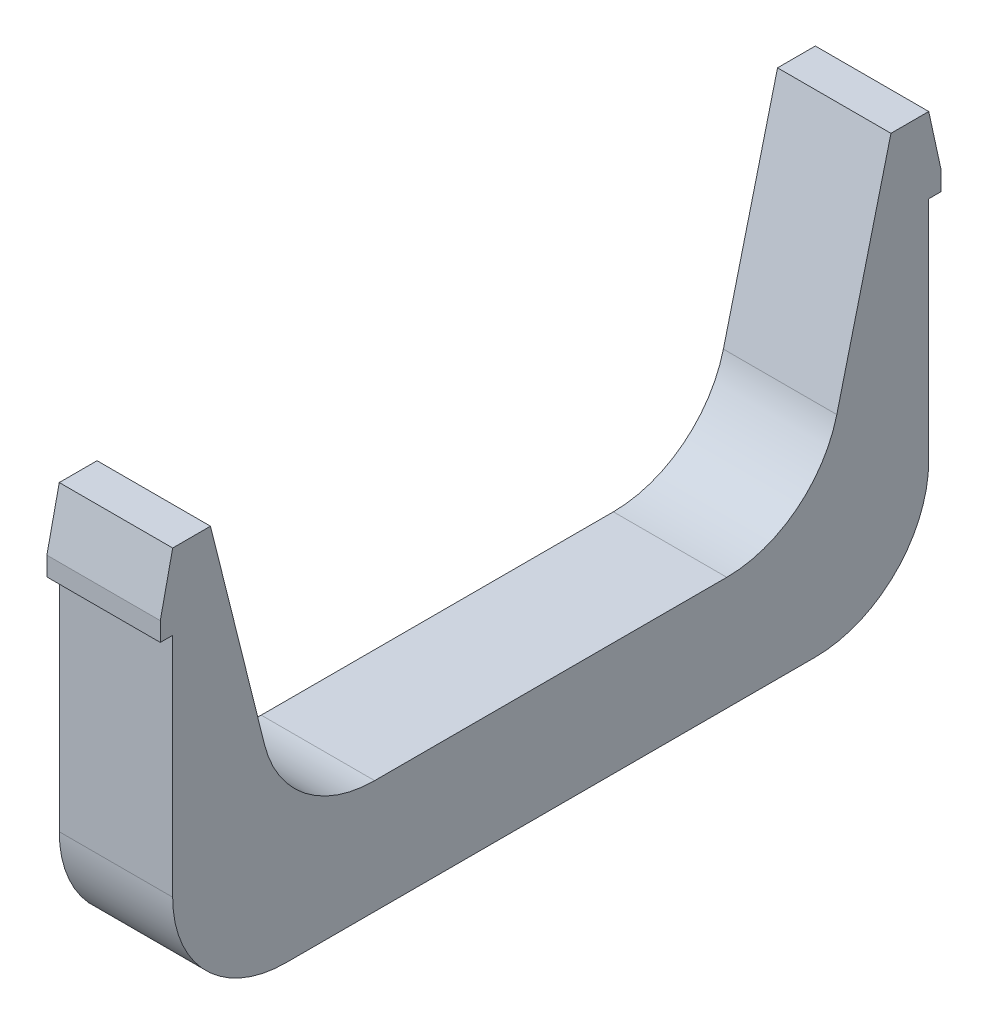
ISO-10303-21;
HEADER;
FILE_DESCRIPTION(('STEP AP214'),'2;1');
FILE_NAME('part.step','',(''),(''),'','','');
FILE_SCHEMA(('AUTOMOTIVE_DESIGN { 1 0 10303 214 1 1 1 1 }'));
ENDSEC;
DATA;
#1=APPLICATION_CONTEXT('core data for automotive mechanical design processes');
#2=APPLICATION_PROTOCOL_DEFINITION('international standard','automotive_design',2000,#1);
#3=PRODUCT_CONTEXT('',#1,'mechanical');
#4=PRODUCT('Part','Part','',(#3));
#5=PRODUCT_RELATED_PRODUCT_CATEGORY('part','',(#4));
#6=PRODUCT_DEFINITION_FORMATION('','',#4);
#7=PRODUCT_DEFINITION_CONTEXT('part definition',#1,'design');
#8=PRODUCT_DEFINITION('design','',#6,#7);
#9=PRODUCT_DEFINITION_SHAPE('','',#8);
#10=(LENGTH_UNIT() NAMED_UNIT(*) SI_UNIT(.MILLI.,.METRE.));
#11=(NAMED_UNIT(*) PLANE_ANGLE_UNIT() SI_UNIT($,.RADIAN.));
#12=(NAMED_UNIT(*) SI_UNIT($,.STERADIAN.) SOLID_ANGLE_UNIT());
#13=UNCERTAINTY_MEASURE_WITH_UNIT(LENGTH_MEASURE(1.E-05),#10,'distance_accuracy_value','');
#14=(GEOMETRIC_REPRESENTATION_CONTEXT(3) GLOBAL_UNCERTAINTY_ASSIGNED_CONTEXT((#13)) GLOBAL_UNIT_ASSIGNED_CONTEXT((#10,
#11,#12)) REPRESENTATION_CONTEXT('',''));
#15=CARTESIAN_POINT('',(0.,0.,0.));
#16=DIRECTION('',(0.,0.,1.));
#17=DIRECTION('',(1.,0.,0.));
#18=AXIS2_PLACEMENT_3D('',#15,#16,#17);
#19=CARTESIAN_POINT('',(-3.,1.5,10.));
#20=DIRECTION('',(0.,-1.,0.));
#21=DIRECTION('',(0.,0.,-1.));
#22=AXIS2_PLACEMENT_3D('',#19,#20,#21);
#23=PLANE('',#22);
#24=DIRECTION('',(0.,0.,-1.));
#25=VECTOR('',#24,1.);
#26=CARTESIAN_POINT('',(-3.,1.5,10.));
#27=LINE('',#26,#25);
#28=CARTESIAN_POINT('',(-3.,1.5,4.65767078078676));
#29=VERTEX_POINT('',#28);
#30=CARTESIAN_POINT('',(-3.,1.5,-4.65767078078676));
#31=VERTEX_POINT('',#30);
#32=EDGE_CURVE('E245',#29,#31,#27,.T.);
#33=ORIENTED_EDGE('',*,*,#32,.F.);
#34=DIRECTION('',(-1.,0.,0.));
#35=VECTOR('',#34,1.);
#36=CARTESIAN_POINT('',(-3.,1.5,4.65767078078676));
#37=LINE('',#36,#35);
#38=CARTESIAN_POINT('',(0.,1.5,4.65767078078676));
#39=VERTEX_POINT('',#38);
#40=EDGE_CURVE('E265',#29,#39,#37,.F.);
#41=ORIENTED_EDGE('',*,*,#40,.T.);
#42=DIRECTION('',(0.,0.,-1.));
#43=VECTOR('',#42,1.);
#44=CARTESIAN_POINT('',(0.,1.5,10.));
#45=LINE('',#44,#43);
#46=CARTESIAN_POINT('',(0.,1.5,-4.65767078078676));
#47=VERTEX_POINT('',#46);
#48=EDGE_CURVE('E279',#39,#47,#45,.T.);
#49=ORIENTED_EDGE('',*,*,#48,.T.);
#50=DIRECTION('',(1.,0.,0.));
#51=VECTOR('',#50,1.);
#52=CARTESIAN_POINT('',(-3.,1.5,-4.65767078078676));
#53=LINE('',#52,#51);
#54=EDGE_CURVE('E263',#47,#31,#53,.F.);
#55=ORIENTED_EDGE('',*,*,#54,.T.);
#56=EDGE_LOOP('',(#33,#41,#49,#55));
#57=FACE_BOUND('',#56,.T.);
#58=ADVANCED_FACE('F36',(#57),#23,.F.);
#59=CARTESIAN_POINT('',(-3.,-1.5,10.));
#60=DIRECTION('',(0.,-1.,0.));
#61=DIRECTION('',(0.,0.,-1.));
#62=AXIS2_PLACEMENT_3D('',#59,#60,#61);
#63=PLANE('',#62);
#64=DIRECTION('',(0.,0.,-1.));
#65=VECTOR('',#64,1.);
#66=CARTESIAN_POINT('',(0.,-1.5,10.));
#67=LINE('',#66,#65);
#68=CARTESIAN_POINT('',(0.,-1.5,7.));
#69=VERTEX_POINT('',#68);
#70=CARTESIAN_POINT('',(0.,-1.5,-7.));
#71=VERTEX_POINT('',#70);
#72=EDGE_CURVE('E238',#69,#71,#67,.T.);
#73=ORIENTED_EDGE('',*,*,#72,.F.);
#74=DIRECTION('',(1.,0.,0.));
#75=VECTOR('',#74,1.);
#76=CARTESIAN_POINT('',(-3.,-1.5,7.));
#77=LINE('',#76,#75);
#78=CARTESIAN_POINT('',(-3.,-1.5,7.));
#79=VERTEX_POINT('',#78);
#80=EDGE_CURVE('E253',#69,#79,#77,.F.);
#81=ORIENTED_EDGE('',*,*,#80,.T.);
#82=DIRECTION('',(0.,0.,-1.));
#83=VECTOR('',#82,1.);
#84=CARTESIAN_POINT('',(-3.,-1.5,10.));
#85=LINE('',#84,#83);
#86=CARTESIAN_POINT('',(-3.,-1.5,-7.));
#87=VERTEX_POINT('',#86);
#88=EDGE_CURVE('E239',#79,#87,#85,.T.);
#89=ORIENTED_EDGE('',*,*,#88,.T.);
#90=DIRECTION('',(1.,0.,0.));
#91=VECTOR('',#90,1.);
#92=CARTESIAN_POINT('',(0.,-1.5,-7.));
#93=LINE('',#92,#91);
#94=EDGE_CURVE('E313',#87,#71,#93,.T.);
#95=ORIENTED_EDGE('',*,*,#94,.T.);
#96=EDGE_LOOP('',(#73,#81,#89,#95));
#97=FACE_BOUND('',#96,.T.);
#98=ADVANCED_FACE('F376',(#97),#63,.T.);
#99=CARTESIAN_POINT('',(-3.,-1.5,10.));
#100=DIRECTION('',(0.,0.,-1.));
#101=DIRECTION('',(-1.,0.,0.));
#102=AXIS2_PLACEMENT_3D('',#99,#100,#101);
#103=PLANE('',#102);
#104=DIRECTION('',(0.,1.,0.));
#105=VECTOR('',#104,1.);
#106=CARTESIAN_POINT('',(-3.,-1.5,10.));
#107=LINE('',#106,#105);
#108=CARTESIAN_POINT('',(-3.,1.5,10.));
#109=VERTEX_POINT('',#108);
#110=CARTESIAN_POINT('',(-3.,7.50000000000001,10.));
#111=VERTEX_POINT('',#110);
#112=EDGE_CURVE('E248',#109,#111,#107,.T.);
#113=ORIENTED_EDGE('',*,*,#112,.F.);
#114=DIRECTION('',(1.,0.,0.));
#115=VECTOR('',#114,1.);
#116=CARTESIAN_POINT('',(0.,1.5,10.));
#117=LINE('',#116,#115);
#118=CARTESIAN_POINT('',(0.,1.5,10.));
#119=VERTEX_POINT('',#118);
#120=EDGE_CURVE('E322',#109,#119,#117,.T.);
#121=ORIENTED_EDGE('',*,*,#120,.T.);
#122=DIRECTION('',(0.,1.,0.));
#123=VECTOR('',#122,1.);
#124=CARTESIAN_POINT('',(0.,-1.5,10.));
#125=LINE('',#124,#123);
#126=CARTESIAN_POINT('',(0.,7.50000000000001,10.));
#127=VERTEX_POINT('',#126);
#128=EDGE_CURVE('E243',#119,#127,#125,.T.);
#129=ORIENTED_EDGE('',*,*,#128,.T.);
#130=DIRECTION('',(1.,0.,0.));
#131=VECTOR('',#130,1.);
#132=CARTESIAN_POINT('',(-1.5,7.50000000000001,10.));
#133=LINE('',#132,#131);
#134=EDGE_CURVE('E209',#111,#127,#133,.T.);
#135=ORIENTED_EDGE('',*,*,#134,.F.);
#136=EDGE_LOOP('',(#113,#121,#129,#135));
#137=FACE_BOUND('',#136,.T.);
#138=ADVANCED_FACE('F342',(#137),#103,.F.);
#139=CARTESIAN_POINT('',(-3.,1.5,-10.));
#140=DIRECTION('',(0.,0.,1.));
#141=DIRECTION('',(1.,0.,0.));
#142=AXIS2_PLACEMENT_3D('',#139,#140,#141);
#143=PLANE('',#142);
#144=DIRECTION('',(0.,-1.,0.));
#145=VECTOR('',#144,1.);
#146=CARTESIAN_POINT('',(0.,1.5,-10.));
#147=LINE('',#146,#145);
#148=CARTESIAN_POINT('',(0.,7.50000000000001,-10.));
#149=VERTEX_POINT('',#148);
#150=CARTESIAN_POINT('',(0.,1.5,-10.));
#151=VERTEX_POINT('',#150);
#152=EDGE_CURVE('E288',#149,#151,#147,.T.);
#153=ORIENTED_EDGE('',*,*,#152,.T.);
#154=DIRECTION('',(1.,0.,0.));
#155=VECTOR('',#154,1.);
#156=CARTESIAN_POINT('',(-3.,1.5,-10.));
#157=LINE('',#156,#155);
#158=CARTESIAN_POINT('',(-3.,1.5,-10.));
#159=VERTEX_POINT('',#158);
#160=EDGE_CURVE('E51',#151,#159,#157,.F.);
#161=ORIENTED_EDGE('',*,*,#160,.T.);
#162=DIRECTION('',(0.,-1.,0.));
#163=VECTOR('',#162,1.);
#164=CARTESIAN_POINT('',(-3.,1.5,-10.));
#165=LINE('',#164,#163);
#166=CARTESIAN_POINT('',(-3.,7.50000000000001,-10.));
#167=VERTEX_POINT('',#166);
#168=EDGE_CURVE('E242',#167,#159,#165,.T.);
#169=ORIENTED_EDGE('',*,*,#168,.F.);
#170=DIRECTION('',(1.,0.,0.));
#171=VECTOR('',#170,1.);
#172=CARTESIAN_POINT('',(-1.5,7.50000000000001,-10.));
#173=LINE('',#172,#171);
#174=EDGE_CURVE('E179',#167,#149,#173,.T.);
#175=ORIENTED_EDGE('',*,*,#174,.T.);
#176=EDGE_LOOP('',(#153,#161,#169,#175));
#177=FACE_BOUND('',#176,.T.);
#178=ADVANCED_FACE('F307',(#177),#143,.F.);
#179=CARTESIAN_POINT('',(-3.,0.,0.));
#180=DIRECTION('',(-1.,0.,0.));
#181=DIRECTION('',(0.,0.,1.));
#182=AXIS2_PLACEMENT_3D('',#179,#180,#181);
#183=PLANE('',#182);
#184=ORIENTED_EDGE('',*,*,#88,.F.);
#185=CARTESIAN_POINT('',(-3.,1.5,7.));
#186=DIRECTION('',(-1.,0.,0.));
#187=DIRECTION('',(0.,0.,1.));
#188=AXIS2_PLACEMENT_3D('',#185,#186,#187);
#189=CIRCLE('',#188,3.);
#190=EDGE_CURVE('E257',#79,#109,#189,.T.);
#191=ORIENTED_EDGE('',*,*,#190,.T.);
#192=ORIENTED_EDGE('',*,*,#112,.T.);
#193=DIRECTION('',(0.,0.,1.));
#194=VECTOR('',#193,1.);
#195=CARTESIAN_POINT('',(-3.,7.50000000000001,9.));
#196=LINE('',#195,#194);
#197=CARTESIAN_POINT('',(-3.,7.50000000000001,10.327));
#198=VERTEX_POINT('',#197);
#199=EDGE_CURVE('E232',#111,#198,#196,.T.);
#200=ORIENTED_EDGE('',*,*,#199,.T.);
#201=DIRECTION('',(0.,-1.,0.));
#202=VECTOR('',#201,1.);
#203=CARTESIAN_POINT('',(-3.,9.50000000000001,10.327));
#204=LINE('',#203,#202);
#205=CARTESIAN_POINT('',(-3.,8.,10.327));
#206=VERTEX_POINT('',#205);
#207=EDGE_CURVE('E204',#206,#198,#204,.T.);
#208=ORIENTED_EDGE('',*,*,#207,.F.);
#209=DIRECTION('',(0.,0.977052744589172,-0.21299749832044));
#210=VECTOR('',#209,1.);
#211=CARTESIAN_POINT('',(-3.,9.70810979032462,9.95463206570923));
#212=LINE('',#211,#210);
#213=CARTESIAN_POINT('',(-3.,9.5,10.));
#214=VERTEX_POINT('',#213);
#215=EDGE_CURVE('E213',#206,#214,#212,.T.);
#216=ORIENTED_EDGE('',*,*,#215,.T.);
#217=DIRECTION('',(0.,0.,1.));
#218=VECTOR('',#217,1.);
#219=CARTESIAN_POINT('',(-3.,9.50000000000001,9.));
#220=LINE('',#219,#218);
#221=CARTESIAN_POINT('',(-3.,9.50000000000001,9.));
#222=VERTEX_POINT('',#221);
#223=EDGE_CURVE('E221',#222,#214,#220,.T.);
#224=ORIENTED_EDGE('',*,*,#223,.F.);
#225=DIRECTION('',(0.,-0.970142500145332,-0.242535625036331));
#226=VECTOR('',#225,1.);
#227=CARTESIAN_POINT('',(-3.,9.50000000000001,9.));
#228=LINE('',#227,#226);
#229=CARTESIAN_POINT('',(-3.,3.77239312489101,7.56809828122276));
#230=VERTEX_POINT('',#229);
#231=EDGE_CURVE('E212',#222,#230,#228,.T.);
#232=ORIENTED_EDGE('',*,*,#231,.T.);
#233=CARTESIAN_POINT('',(-3.,4.5,4.65767078078676));
#234=DIRECTION('',(-1.,0.,0.));
#235=DIRECTION('',(0.,0.,1.));
#236=AXIS2_PLACEMENT_3D('',#233,#234,#235);
#237=CIRCLE('',#236,3.);
#238=EDGE_CURVE('E270',#230,#29,#237,.F.);
#239=ORIENTED_EDGE('',*,*,#238,.T.);
#240=ORIENTED_EDGE('',*,*,#32,.T.);
#241=CARTESIAN_POINT('',(-3.,4.5,-4.65767078078676));
#242=DIRECTION('',(-1.,0.,0.));
#243=DIRECTION('',(0.,0.,1.));
#244=AXIS2_PLACEMENT_3D('',#241,#242,#243);
#245=CIRCLE('',#244,3.);
#246=CARTESIAN_POINT('',(-3.,3.77239312489101,-7.56809828122276));
#247=VERTEX_POINT('',#246);
#248=EDGE_CURVE('E11',#31,#247,#245,.F.);
#249=ORIENTED_EDGE('',*,*,#248,.T.);
#250=DIRECTION('',(0.,-0.970142500145332,0.242535625036331));
#251=VECTOR('',#250,1.);
#252=CARTESIAN_POINT('',(-3.,9.50000000000001,-9.));
#253=LINE('',#252,#251);
#254=CARTESIAN_POINT('',(-3.,9.50000000000001,-9.));
#255=VERTEX_POINT('',#254);
#256=EDGE_CURVE('E188',#255,#247,#253,.T.);
#257=ORIENTED_EDGE('',*,*,#256,.F.);
#258=DIRECTION('',(0.,0.,-1.));
#259=VECTOR('',#258,1.);
#260=CARTESIAN_POINT('',(-3.,9.50000000000001,-9.));
#261=LINE('',#260,#259);
#262=CARTESIAN_POINT('',(-3.,9.5,-10.));
#263=VERTEX_POINT('',#262);
#264=EDGE_CURVE('E189',#255,#263,#261,.T.);
#265=ORIENTED_EDGE('',*,*,#264,.T.);
#266=DIRECTION('',(0.,0.977052744589172,0.21299749832044));
#267=VECTOR('',#266,1.);
#268=CARTESIAN_POINT('',(-3.,9.70810979032462,-9.95463206570923));
#269=LINE('',#268,#267);
#270=CARTESIAN_POINT('',(-3.,8.,-10.327));
#271=VERTEX_POINT('',#270);
#272=EDGE_CURVE('E187',#271,#263,#269,.T.);
#273=ORIENTED_EDGE('',*,*,#272,.F.);
#274=DIRECTION('',(0.,-1.,0.));
#275=VECTOR('',#274,1.);
#276=CARTESIAN_POINT('',(-3.,9.50000000000001,-10.327));
#277=LINE('',#276,#275);
#278=CARTESIAN_POINT('',(-3.,7.50000000000001,-10.327));
#279=VERTEX_POINT('',#278);
#280=EDGE_CURVE('E166',#271,#279,#277,.T.);
#281=ORIENTED_EDGE('',*,*,#280,.T.);
#282=DIRECTION('',(0.,0.,-1.));
#283=VECTOR('',#282,1.);
#284=CARTESIAN_POINT('',(-3.,7.50000000000001,-9.));
#285=LINE('',#284,#283);
#286=EDGE_CURVE('E172',#167,#279,#285,.T.);
#287=ORIENTED_EDGE('',*,*,#286,.F.);
#288=ORIENTED_EDGE('',*,*,#168,.T.);
#289=CARTESIAN_POINT('',(-3.,1.5,-7.));
#290=DIRECTION('',(-1.,0.,0.));
#291=DIRECTION('',(0.,0.,1.));
#292=AXIS2_PLACEMENT_3D('',#289,#290,#291);
#293=CIRCLE('',#292,3.);
#294=EDGE_CURVE('E255',#159,#87,#293,.T.);
#295=ORIENTED_EDGE('',*,*,#294,.T.);
#296=EDGE_LOOP('',(#184,#191,#192,#200,#208,#216,#224,#232,#239,#240,#249,#257,#265,#273,#281,
#287,#288,#295));
#297=FACE_BOUND('',#296,.T.);
#298=ADVANCED_FACE('F184',(#297),#183,.T.);
#299=CARTESIAN_POINT('',(0.,0.,0.));
#300=DIRECTION('',(-1.,0.,0.));
#301=DIRECTION('',(0.,0.,1.));
#302=AXIS2_PLACEMENT_3D('',#299,#300,#301);
#303=PLANE('',#302);
#304=ORIENTED_EDGE('',*,*,#128,.F.);
#305=CARTESIAN_POINT('',(0.,1.5,7.));
#306=DIRECTION('',(-1.,0.,0.));
#307=DIRECTION('',(0.,0.,1.));
#308=AXIS2_PLACEMENT_3D('',#305,#306,#307);
#309=CIRCLE('',#308,3.);
#310=EDGE_CURVE('E318',#119,#69,#309,.F.);
#311=ORIENTED_EDGE('',*,*,#310,.T.);
#312=ORIENTED_EDGE('',*,*,#72,.T.);
#313=CARTESIAN_POINT('',(0.,1.5,-7.));
#314=DIRECTION('',(-1.,0.,0.));
#315=DIRECTION('',(0.,0.,1.));
#316=AXIS2_PLACEMENT_3D('',#313,#314,#315);
#317=CIRCLE('',#316,3.);
#318=EDGE_CURVE('E314',#71,#151,#317,.F.);
#319=ORIENTED_EDGE('',*,*,#318,.T.);
#320=ORIENTED_EDGE('',*,*,#152,.F.);
#321=DIRECTION('',(0.,0.,-1.));
#322=VECTOR('',#321,1.);
#323=CARTESIAN_POINT('',(0.,7.50000000000001,-10.));
#324=LINE('',#323,#322);
#325=CARTESIAN_POINT('',(0.,7.50000000000001,-10.327));
#326=VERTEX_POINT('',#325);
#327=EDGE_CURVE('E200',#149,#326,#324,.T.);
#328=ORIENTED_EDGE('',*,*,#327,.T.);
#329=DIRECTION('',(0.,1.,0.));
#330=VECTOR('',#329,1.);
#331=CARTESIAN_POINT('',(0.,9.50000000000001,-10.327));
#332=LINE('',#331,#330);
#333=CARTESIAN_POINT('',(0.,8.,-10.327));
#334=VERTEX_POINT('',#333);
#335=EDGE_CURVE('E168',#326,#334,#332,.T.);
#336=ORIENTED_EDGE('',*,*,#335,.T.);
#337=DIRECTION('',(0.,-0.977052744589172,-0.21299749832044));
#338=VECTOR('',#337,1.);
#339=CARTESIAN_POINT('',(0.,9.70810979032462,-9.95463206570923));
#340=LINE('',#339,#338);
#341=CARTESIAN_POINT('',(0.,9.50000000000001,-10.));
#342=VERTEX_POINT('',#341);
#343=EDGE_CURVE('E173',#342,#334,#340,.T.);
#344=ORIENTED_EDGE('',*,*,#343,.F.);
#345=DIRECTION('',(0.,0.,-1.));
#346=VECTOR('',#345,1.);
#347=CARTESIAN_POINT('',(0.,9.50000000000001,-9.));
#348=LINE('',#347,#346);
#349=CARTESIAN_POINT('',(0.,9.50000000000001,-9.));
#350=VERTEX_POINT('',#349);
#351=EDGE_CURVE('E199',#350,#342,#348,.T.);
#352=ORIENTED_EDGE('',*,*,#351,.F.);
#353=DIRECTION('',(0.,0.970142500145332,-0.242535625036331));
#354=VECTOR('',#353,1.);
#355=CARTESIAN_POINT('',(0.,9.50000000000001,-9.));
#356=LINE('',#355,#354);
#357=CARTESIAN_POINT('',(0.,3.77239312489101,-7.56809828122276));
#358=VERTEX_POINT('',#357);
#359=EDGE_CURVE('E191',#358,#350,#356,.T.);
#360=ORIENTED_EDGE('',*,*,#359,.F.);
#361=CARTESIAN_POINT('',(0.,4.5,-4.65767078078676));
#362=DIRECTION('',(-1.,0.,0.));
#363=DIRECTION('',(0.,0.,1.));
#364=AXIS2_PLACEMENT_3D('',#361,#362,#363);
#365=CIRCLE('',#364,3.);
#366=EDGE_CURVE('E44',#358,#47,#365,.T.);
#367=ORIENTED_EDGE('',*,*,#366,.T.);
#368=ORIENTED_EDGE('',*,*,#48,.F.);
#369=CARTESIAN_POINT('',(0.,4.5,4.65767078078676));
#370=DIRECTION('',(-1.,0.,0.));
#371=DIRECTION('',(0.,0.,1.));
#372=AXIS2_PLACEMENT_3D('',#369,#370,#371);
#373=CIRCLE('',#372,3.);
#374=CARTESIAN_POINT('',(0.,3.77239312489101,7.56809828122276));
#375=VERTEX_POINT('',#374);
#376=EDGE_CURVE('E272',#39,#375,#373,.T.);
#377=ORIENTED_EDGE('',*,*,#376,.T.);
#378=DIRECTION('',(0.,0.970142500145332,0.242535625036331));
#379=VECTOR('',#378,1.);
#380=CARTESIAN_POINT('',(0.,9.50000000000001,9.));
#381=LINE('',#380,#379);
#382=CARTESIAN_POINT('',(0.,9.50000000000001,9.));
#383=VERTEX_POINT('',#382);
#384=EDGE_CURVE('E217',#375,#383,#381,.T.);
#385=ORIENTED_EDGE('',*,*,#384,.T.);
#386=DIRECTION('',(0.,0.,1.));
#387=VECTOR('',#386,1.);
#388=CARTESIAN_POINT('',(0.,9.50000000000001,9.));
#389=LINE('',#388,#387);
#390=CARTESIAN_POINT('',(0.,9.50000000000001,10.));
#391=VERTEX_POINT('',#390);
#392=EDGE_CURVE('E218',#383,#391,#389,.T.);
#393=ORIENTED_EDGE('',*,*,#392,.T.);
#394=DIRECTION('',(0.,-0.977052744589172,0.21299749832044));
#395=VECTOR('',#394,1.);
#396=CARTESIAN_POINT('',(0.,9.70810979032462,9.95463206570923));
#397=LINE('',#396,#395);
#398=CARTESIAN_POINT('',(0.,8.,10.327));
#399=VERTEX_POINT('',#398);
#400=EDGE_CURVE('E229',#391,#399,#397,.T.);
#401=ORIENTED_EDGE('',*,*,#400,.T.);
#402=DIRECTION('',(0.,1.,0.));
#403=VECTOR('',#402,1.);
#404=CARTESIAN_POINT('',(0.,9.50000000000001,10.327));
#405=LINE('',#404,#403);
#406=CARTESIAN_POINT('',(0.,7.50000000000001,10.327));
#407=VERTEX_POINT('',#406);
#408=EDGE_CURVE('E180',#407,#399,#405,.T.);
#409=ORIENTED_EDGE('',*,*,#408,.F.);
#410=DIRECTION('',(0.,0.,1.));
#411=VECTOR('',#410,1.);
#412=CARTESIAN_POINT('',(0.,7.50000000000001,10.));
#413=LINE('',#412,#411);
#414=EDGE_CURVE('E208',#127,#407,#413,.T.);
#415=ORIENTED_EDGE('',*,*,#414,.F.);
#416=EDGE_LOOP('',(#304,#311,#312,#319,#320,#328,#336,#344,#352,#360,#367,#368,#377,#385,#393,
#401,#409,#415));
#417=FACE_BOUND('',#416,.T.);
#418=ADVANCED_FACE('F278',(#417),#303,.F.);
#419=CARTESIAN_POINT('',(-1.5,7.50000000000001,10.));
#420=DIRECTION('',(0.,-1.,0.));
#421=DIRECTION('',(0.,0.,-1.));
#422=AXIS2_PLACEMENT_3D('',#419,#420,#421);
#423=PLANE('',#422);
#424=DIRECTION('',(1.,0.,0.));
#425=VECTOR('',#424,1.);
#426=CARTESIAN_POINT('',(-1.5,7.50000000000001,10.327));
#427=LINE('',#426,#425);
#428=EDGE_CURVE('E227',#198,#407,#427,.T.);
#429=ORIENTED_EDGE('',*,*,#428,.F.);
#430=ORIENTED_EDGE('',*,*,#199,.F.);
#431=ORIENTED_EDGE('',*,*,#134,.T.);
#432=ORIENTED_EDGE('',*,*,#414,.T.);
#433=EDGE_LOOP('',(#429,#430,#431,#432));
#434=FACE_BOUND('',#433,.T.);
#435=ADVANCED_FACE('F340',(#434),#423,.T.);
#436=CARTESIAN_POINT('',(-1.5,7.5,10.327));
#437=DIRECTION('',(0.,0.,-1.));
#438=DIRECTION('',(-1.,0.,0.));
#439=AXIS2_PLACEMENT_3D('',#436,#437,#438);
#440=PLANE('',#439);
#441=DIRECTION('',(-1.,0.,0.));
#442=VECTOR('',#441,1.);
#443=CARTESIAN_POINT('',(-1.5,8.,10.327));
#444=LINE('',#443,#442);
#445=EDGE_CURVE('E206',#399,#206,#444,.T.);
#446=ORIENTED_EDGE('',*,*,#445,.T.);
#447=ORIENTED_EDGE('',*,*,#207,.T.);
#448=ORIENTED_EDGE('',*,*,#428,.T.);
#449=ORIENTED_EDGE('',*,*,#408,.T.);
#450=EDGE_LOOP('',(#446,#447,#448,#449));
#451=FACE_BOUND('',#450,.T.);
#452=ADVANCED_FACE('F365',(#451),#440,.F.);
#453=CARTESIAN_POINT('',(-1.5,9.5,10.));
#454=DIRECTION('',(0.,0.21299749832044,0.977052744589172));
#455=DIRECTION('',(0.,-0.977052744589172,0.21299749832044));
#456=AXIS2_PLACEMENT_3D('',#453,#454,#455);
#457=PLANE('',#456);
#458=ORIENTED_EDGE('',*,*,#445,.F.);
#459=ORIENTED_EDGE('',*,*,#400,.F.);
#460=DIRECTION('',(1.,0.,0.));
#461=VECTOR('',#460,1.);
#462=CARTESIAN_POINT('',(-1.5,9.50000000000001,10.));
#463=LINE('',#462,#461);
#464=EDGE_CURVE('E224',#214,#391,#463,.T.);
#465=ORIENTED_EDGE('',*,*,#464,.F.);
#466=ORIENTED_EDGE('',*,*,#215,.F.);
#467=EDGE_LOOP('',(#458,#459,#465,#466));
#468=FACE_BOUND('',#467,.T.);
#469=ADVANCED_FACE('F362',(#468),#457,.T.);
#470=CARTESIAN_POINT('',(-1.5,9.50000000000001,9.));
#471=DIRECTION('',(0.,1.,0.));
#472=DIRECTION('',(0.,0.,1.));
#473=AXIS2_PLACEMENT_3D('',#470,#471,#472);
#474=PLANE('',#473);
#475=ORIENTED_EDGE('',*,*,#223,.T.);
#476=ORIENTED_EDGE('',*,*,#464,.T.);
#477=ORIENTED_EDGE('',*,*,#392,.F.);
#478=DIRECTION('',(-1.,0.,0.));
#479=VECTOR('',#478,1.);
#480=CARTESIAN_POINT('',(-1.5,9.50000000000001,9.));
#481=LINE('',#480,#479);
#482=EDGE_CURVE('E214',#383,#222,#481,.T.);
#483=ORIENTED_EDGE('',*,*,#482,.T.);
#484=EDGE_LOOP('',(#475,#476,#477,#483));
#485=FACE_BOUND('',#484,.T.);
#486=ADVANCED_FACE('F357',(#485),#474,.T.);
#487=CARTESIAN_POINT('',(-1.5,9.50000000000001,9.));
#488=DIRECTION('',(0.,0.242535625036331,-0.970142500145332));
#489=DIRECTION('',(0.,0.970142500145332,0.242535625036331));
#490=AXIS2_PLACEMENT_3D('',#487,#488,#489);
#491=PLANE('',#490);
#492=ORIENTED_EDGE('',*,*,#384,.F.);
#493=DIRECTION('',(-1.,0.,0.));
#494=VECTOR('',#493,1.);
#495=CARTESIAN_POINT('',(-1.5,3.77239312489101,7.56809828122276));
#496=LINE('',#495,#494);
#497=EDGE_CURVE('E260',#375,#230,#496,.T.);
#498=ORIENTED_EDGE('',*,*,#497,.T.);
#499=ORIENTED_EDGE('',*,*,#231,.F.);
#500=ORIENTED_EDGE('',*,*,#482,.F.);
#501=EDGE_LOOP('',(#492,#498,#499,#500));
#502=FACE_BOUND('',#501,.T.);
#503=ADVANCED_FACE('F351',(#502),#491,.T.);
#504=CARTESIAN_POINT('',(-1.5,9.50000000000001,-9.));
#505=DIRECTION('',(0.,0.242535625036331,0.970142500145332));
#506=DIRECTION('',(0.,0.970142500145332,-0.242535625036331));
#507=AXIS2_PLACEMENT_3D('',#504,#505,#506);
#508=PLANE('',#507);
#509=ORIENTED_EDGE('',*,*,#256,.T.);
#510=DIRECTION('',(1.,0.,0.));
#511=VECTOR('',#510,1.);
#512=CARTESIAN_POINT('',(-1.5,3.77239312489101,-7.56809828122276));
#513=LINE('',#512,#511);
#514=EDGE_CURVE('E267',#247,#358,#513,.T.);
#515=ORIENTED_EDGE('',*,*,#514,.T.);
#516=ORIENTED_EDGE('',*,*,#359,.T.);
#517=DIRECTION('',(-1.,0.,0.));
#518=VECTOR('',#517,1.);
#519=CARTESIAN_POINT('',(-1.5,9.50000000000001,-9.));
#520=LINE('',#519,#518);
#521=EDGE_CURVE('E201',#350,#255,#520,.T.);
#522=ORIENTED_EDGE('',*,*,#521,.T.);
#523=EDGE_LOOP('',(#509,#515,#516,#522));
#524=FACE_BOUND('',#523,.T.);
#525=ADVANCED_FACE('F291',(#524),#508,.T.);
#526=CARTESIAN_POINT('',(-1.5,9.50000000000001,-9.));
#527=DIRECTION('',(0.,1.,0.));
#528=DIRECTION('',(0.,0.,-1.));
#529=AXIS2_PLACEMENT_3D('',#526,#527,#528);
#530=PLANE('',#529);
#531=ORIENTED_EDGE('',*,*,#264,.F.);
#532=ORIENTED_EDGE('',*,*,#521,.F.);
#533=ORIENTED_EDGE('',*,*,#351,.T.);
#534=DIRECTION('',(1.,0.,0.));
#535=VECTOR('',#534,1.);
#536=CARTESIAN_POINT('',(-1.5,9.50000000000001,-10.));
#537=LINE('',#536,#535);
#538=EDGE_CURVE('E298',#263,#342,#537,.T.);
#539=ORIENTED_EDGE('',*,*,#538,.F.);
#540=EDGE_LOOP('',(#531,#532,#533,#539));
#541=FACE_BOUND('',#540,.T.);
#542=ADVANCED_FACE('F295',(#541),#530,.T.);
#543=CARTESIAN_POINT('',(-1.5,9.5,-10.));
#544=DIRECTION('',(0.,0.21299749832044,-0.977052744589172));
#545=DIRECTION('',(0.,-0.977052744589172,-0.21299749832044));
#546=AXIS2_PLACEMENT_3D('',#543,#544,#545);
#547=PLANE('',#546);
#548=DIRECTION('',(-1.,0.,0.));
#549=VECTOR('',#548,1.);
#550=CARTESIAN_POINT('',(-1.5,8.,-10.327));
#551=LINE('',#550,#549);
#552=EDGE_CURVE('E196',#334,#271,#551,.T.);
#553=ORIENTED_EDGE('',*,*,#552,.T.);
#554=ORIENTED_EDGE('',*,*,#272,.T.);
#555=ORIENTED_EDGE('',*,*,#538,.T.);
#556=ORIENTED_EDGE('',*,*,#343,.T.);
#557=EDGE_LOOP('',(#553,#554,#555,#556));
#558=FACE_BOUND('',#557,.T.);
#559=ADVANCED_FACE('F302',(#558),#547,.T.);
#560=CARTESIAN_POINT('',(-1.5,7.50000000000001,-10.));
#561=DIRECTION('',(0.,-1.,0.));
#562=DIRECTION('',(0.,0.,1.));
#563=AXIS2_PLACEMENT_3D('',#560,#561,#562);
#564=PLANE('',#563);
#565=DIRECTION('',(1.,0.,0.));
#566=VECTOR('',#565,1.);
#567=CARTESIAN_POINT('',(-1.5,7.50000000000001,-10.327));
#568=LINE('',#567,#566);
#569=EDGE_CURVE('E162',#279,#326,#568,.T.);
#570=ORIENTED_EDGE('',*,*,#569,.T.);
#571=ORIENTED_EDGE('',*,*,#327,.F.);
#572=ORIENTED_EDGE('',*,*,#174,.F.);
#573=ORIENTED_EDGE('',*,*,#286,.T.);
#574=EDGE_LOOP('',(#570,#571,#572,#573));
#575=FACE_BOUND('',#574,.T.);
#576=ADVANCED_FACE('F177',(#575),#564,.T.);
#577=CARTESIAN_POINT('',(-1.5,7.5,-10.327));
#578=DIRECTION('',(0.,0.,1.));
#579=DIRECTION('',(-1.,0.,0.));
#580=AXIS2_PLACEMENT_3D('',#577,#578,#579);
#581=PLANE('',#580);
#582=ORIENTED_EDGE('',*,*,#552,.F.);
#583=ORIENTED_EDGE('',*,*,#335,.F.);
#584=ORIENTED_EDGE('',*,*,#569,.F.);
#585=ORIENTED_EDGE('',*,*,#280,.F.);
#586=EDGE_LOOP('',(#582,#583,#584,#585));
#587=FACE_BOUND('',#586,.T.);
#588=ADVANCED_FACE('F164',(#587),#581,.F.);
#589=CARTESIAN_POINT('',(-3.,1.5,7.));
#590=DIRECTION('',(-1.,0.,0.));
#591=DIRECTION('',(0.,0.,1.));
#592=AXIS2_PLACEMENT_3D('',#589,#590,#591);
#593=CYLINDRICAL_SURFACE('',#592,3.);
#594=ORIENTED_EDGE('',*,*,#190,.F.);
#595=ORIENTED_EDGE('',*,*,#80,.F.);
#596=ORIENTED_EDGE('',*,*,#310,.F.);
#597=ORIENTED_EDGE('',*,*,#120,.F.);
#598=EDGE_LOOP('',(#594,#595,#596,#597));
#599=FACE_BOUND('',#598,.T.);
#600=ADVANCED_FACE('F387',(#599),#593,.T.);
#601=CARTESIAN_POINT('',(-3.,1.5,-7.));
#602=DIRECTION('',(-1.,0.,0.));
#603=DIRECTION('',(0.,0.,1.));
#604=AXIS2_PLACEMENT_3D('',#601,#602,#603);
#605=CYLINDRICAL_SURFACE('',#604,3.);
#606=ORIENTED_EDGE('',*,*,#294,.F.);
#607=ORIENTED_EDGE('',*,*,#160,.F.);
#608=ORIENTED_EDGE('',*,*,#318,.F.);
#609=ORIENTED_EDGE('',*,*,#94,.F.);
#610=EDGE_LOOP('',(#606,#607,#608,#609));
#611=FACE_BOUND('',#610,.T.);
#612=ADVANCED_FACE('F311',(#611),#605,.T.);
#613=CARTESIAN_POINT('',(-1.5,4.5,4.65767078078676));
#614=DIRECTION('',(-1.,0.,0.));
#615=DIRECTION('',(0.,0.,1.));
#616=AXIS2_PLACEMENT_3D('',#613,#614,#615);
#617=CYLINDRICAL_SURFACE('',#616,3.);
#618=ORIENTED_EDGE('',*,*,#376,.F.);
#619=ORIENTED_EDGE('',*,*,#40,.F.);
#620=ORIENTED_EDGE('',*,*,#238,.F.);
#621=ORIENTED_EDGE('',*,*,#497,.F.);
#622=EDGE_LOOP('',(#618,#619,#620,#621));
#623=FACE_BOUND('',#622,.T.);
#624=ADVANCED_FACE('F354',(#623),#617,.F.);
#625=CARTESIAN_POINT('',(-1.5,4.5,-4.65767078078676));
#626=DIRECTION('',(1.,0.,0.));
#627=DIRECTION('',(0.,0.,-1.));
#628=AXIS2_PLACEMENT_3D('',#625,#626,#627);
#629=CYLINDRICAL_SURFACE('',#628,3.);
#630=ORIENTED_EDGE('',*,*,#248,.F.);
#631=ORIENTED_EDGE('',*,*,#54,.F.);
#632=ORIENTED_EDGE('',*,*,#366,.F.);
#633=ORIENTED_EDGE('',*,*,#514,.F.);
#634=EDGE_LOOP('',(#630,#631,#632,#633));
#635=FACE_BOUND('',#634,.T.);
#636=ADVANCED_FACE('F38',(#635),#629,.F.);
#637=CLOSED_SHELL('',(#58,#98,#138,#178,#298,#418,#435,#452,#469,#486,#503,#525,#542,#559,#576,
#588,#600,#612,#624,#636));
#638=MANIFOLD_SOLID_BREP('B2',#637);
#639=ADVANCED_BREP_SHAPE_REPRESENTATION('',(#18,#638),#14);
#640=SHAPE_DEFINITION_REPRESENTATION(#9,#639);
ENDSEC;
END-ISO-10303-21;
